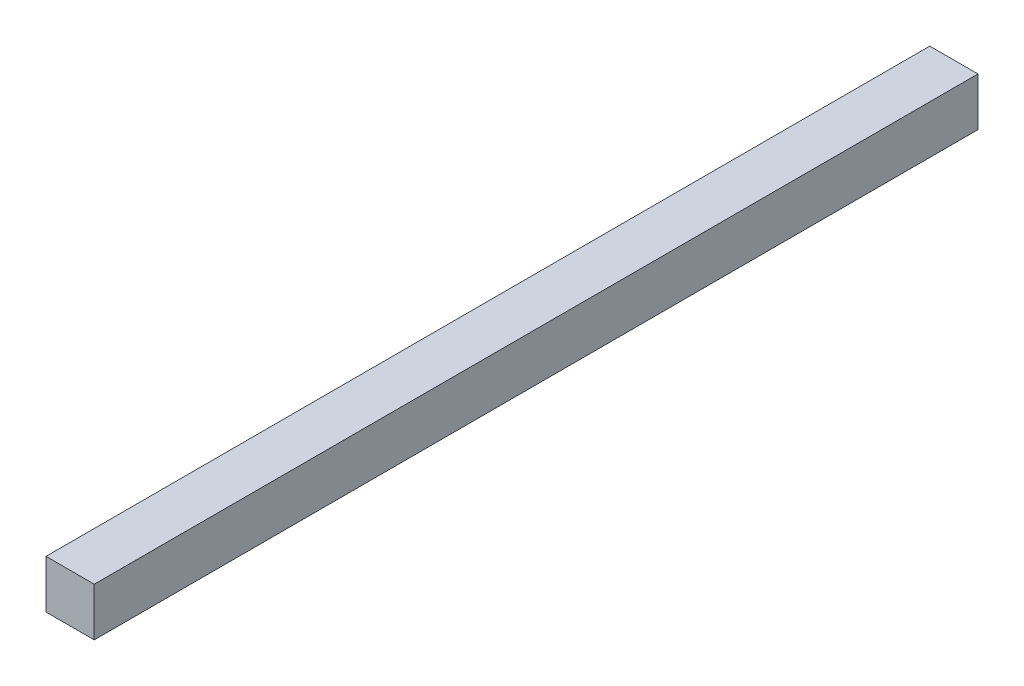
ISO-10303-21;
HEADER;
FILE_DESCRIPTION(('STEP AP214'),'2;1');
FILE_NAME('part.step','',(''),(''),'','','');
FILE_SCHEMA(('AUTOMOTIVE_DESIGN { 1 0 10303 214 1 1 1 1 }'));
ENDSEC;
DATA;
#1=APPLICATION_CONTEXT('core data for automotive mechanical design processes');
#2=APPLICATION_PROTOCOL_DEFINITION('international standard','automotive_design',2000,#1);
#3=PRODUCT_CONTEXT('',#1,'mechanical');
#4=PRODUCT('Part','Part','',(#3));
#5=PRODUCT_RELATED_PRODUCT_CATEGORY('part','',(#4));
#6=PRODUCT_DEFINITION_FORMATION('','',#4);
#7=PRODUCT_DEFINITION_CONTEXT('part definition',#1,'design');
#8=PRODUCT_DEFINITION('design','',#6,#7);
#9=PRODUCT_DEFINITION_SHAPE('','',#8);
#10=(LENGTH_UNIT() NAMED_UNIT(*) SI_UNIT(.MILLI.,.METRE.));
#11=(NAMED_UNIT(*) PLANE_ANGLE_UNIT() SI_UNIT($,.RADIAN.));
#12=(NAMED_UNIT(*) SI_UNIT($,.STERADIAN.) SOLID_ANGLE_UNIT());
#13=UNCERTAINTY_MEASURE_WITH_UNIT(LENGTH_MEASURE(1.E-05),#10,'distance_accuracy_value','');
#14=(GEOMETRIC_REPRESENTATION_CONTEXT(3) GLOBAL_UNCERTAINTY_ASSIGNED_CONTEXT((#13)) GLOBAL_UNIT_ASSIGNED_CONTEXT((#10,
#11,#12)) REPRESENTATION_CONTEXT('',''));
#15=CARTESIAN_POINT('',(0.,0.,0.));
#16=DIRECTION('',(0.,0.,1.));
#17=DIRECTION('',(1.,0.,0.));
#18=AXIS2_PLACEMENT_3D('',#15,#16,#17);
#19=CARTESIAN_POINT('',(-6.35,-6.35,116.35));
#20=DIRECTION('',(1.,0.,0.));
#21=DIRECTION('',(0.,0.,-1.));
#22=AXIS2_PLACEMENT_3D('',#19,#20,#21);
#23=PLANE('',#22);
#24=DIRECTION('',(0.,-1.,0.));
#25=VECTOR('',#24,1.);
#26=CARTESIAN_POINT('',(-6.35,-6.35,-116.35));
#27=LINE('',#26,#25);
#28=CARTESIAN_POINT('',(-6.35,6.35,-116.35));
#29=VERTEX_POINT('',#28);
#30=CARTESIAN_POINT('',(-6.35,-6.35,-116.35));
#31=VERTEX_POINT('',#30);
#32=EDGE_CURVE('E96',#29,#31,#27,.T.);
#33=ORIENTED_EDGE('',*,*,#32,.T.);
#34=DIRECTION('',(0.,0.,-1.));
#35=VECTOR('',#34,1.);
#36=CARTESIAN_POINT('',(-6.35,-6.35,116.35));
#37=LINE('',#36,#35);
#38=CARTESIAN_POINT('',(-6.35,-6.35,116.35));
#39=VERTEX_POINT('',#38);
#40=EDGE_CURVE('E11',#39,#31,#37,.T.);
#41=ORIENTED_EDGE('',*,*,#40,.F.);
#42=DIRECTION('',(0.,-1.,0.));
#43=VECTOR('',#42,1.);
#44=CARTESIAN_POINT('',(-6.35,-6.35,116.35));
#45=LINE('',#44,#43);
#46=CARTESIAN_POINT('',(-6.35,6.35,116.35));
#47=VERTEX_POINT('',#46);
#48=EDGE_CURVE('E84',#47,#39,#45,.T.);
#49=ORIENTED_EDGE('',*,*,#48,.F.);
#50=DIRECTION('',(0.,0.,-1.));
#51=VECTOR('',#50,1.);
#52=CARTESIAN_POINT('',(-6.35,6.35,116.35));
#53=LINE('',#52,#51);
#54=EDGE_CURVE('E92',#47,#29,#53,.T.);
#55=ORIENTED_EDGE('',*,*,#54,.T.);
#56=EDGE_LOOP('',(#33,#41,#49,#55));
#57=FACE_BOUND('',#56,.T.);
#58=ADVANCED_FACE('F33',(#57),#23,.F.);
#59=CARTESIAN_POINT('',(6.35,-6.35,116.35));
#60=DIRECTION('',(0.,1.,0.));
#61=DIRECTION('',(-1.,0.,0.));
#62=AXIS2_PLACEMENT_3D('',#59,#60,#61);
#63=PLANE('',#62);
#64=DIRECTION('',(1.,0.,0.));
#65=VECTOR('',#64,1.);
#66=CARTESIAN_POINT('',(6.35,-6.35,-116.35));
#67=LINE('',#66,#65);
#68=CARTESIAN_POINT('',(6.35,-6.35,-116.35));
#69=VERTEX_POINT('',#68);
#70=EDGE_CURVE('E88',#31,#69,#67,.T.);
#71=ORIENTED_EDGE('',*,*,#70,.T.);
#72=DIRECTION('',(0.,0.,-1.));
#73=VECTOR('',#72,1.);
#74=CARTESIAN_POINT('',(6.35,-6.35,116.35));
#75=LINE('',#74,#73);
#76=CARTESIAN_POINT('',(6.35,-6.35,116.35));
#77=VERTEX_POINT('',#76);
#78=EDGE_CURVE('E41',#77,#69,#75,.T.);
#79=ORIENTED_EDGE('',*,*,#78,.F.);
#80=DIRECTION('',(1.,0.,0.));
#81=VECTOR('',#80,1.);
#82=CARTESIAN_POINT('',(6.35,-6.35,116.35));
#83=LINE('',#82,#81);
#84=EDGE_CURVE('E79',#39,#77,#83,.T.);
#85=ORIENTED_EDGE('',*,*,#84,.F.);
#86=ORIENTED_EDGE('',*,*,#40,.T.);
#87=EDGE_LOOP('',(#71,#79,#85,#86));
#88=FACE_BOUND('',#87,.T.);
#89=ADVANCED_FACE('F87',(#88),#63,.F.);
#90=CARTESIAN_POINT('',(6.35,-6.35,116.35));
#91=DIRECTION('',(-1.,0.,0.));
#92=DIRECTION('',(0.,0.,1.));
#93=AXIS2_PLACEMENT_3D('',#90,#91,#92);
#94=PLANE('',#93);
#95=DIRECTION('',(0.,1.,0.));
#96=VECTOR('',#95,1.);
#97=CARTESIAN_POINT('',(6.35,-6.35,-116.35));
#98=LINE('',#97,#96);
#99=CARTESIAN_POINT('',(6.35,6.35,-116.35));
#100=VERTEX_POINT('',#99);
#101=EDGE_CURVE('E66',#69,#100,#98,.T.);
#102=ORIENTED_EDGE('',*,*,#101,.T.);
#103=DIRECTION('',(0.,0.,-1.));
#104=VECTOR('',#103,1.);
#105=CARTESIAN_POINT('',(6.35,6.35,116.35));
#106=LINE('',#105,#104);
#107=CARTESIAN_POINT('',(6.35,6.35,116.35));
#108=VERTEX_POINT('',#107);
#109=EDGE_CURVE('E89',#108,#100,#106,.T.);
#110=ORIENTED_EDGE('',*,*,#109,.F.);
#111=DIRECTION('',(0.,1.,0.));
#112=VECTOR('',#111,1.);
#113=CARTESIAN_POINT('',(6.35,-6.35,116.35));
#114=LINE('',#113,#112);
#115=EDGE_CURVE('E82',#77,#108,#114,.T.);
#116=ORIENTED_EDGE('',*,*,#115,.F.);
#117=ORIENTED_EDGE('',*,*,#78,.T.);
#118=EDGE_LOOP('',(#102,#110,#116,#117));
#119=FACE_BOUND('',#118,.T.);
#120=ADVANCED_FACE('F90',(#119),#94,.F.);
#121=CARTESIAN_POINT('',(6.35,6.35,116.35));
#122=DIRECTION('',(0.,-1.,0.));
#123=DIRECTION('',(1.,0.,0.));
#124=AXIS2_PLACEMENT_3D('',#121,#122,#123);
#125=PLANE('',#124);
#126=DIRECTION('',(-1.,0.,0.));
#127=VECTOR('',#126,1.);
#128=CARTESIAN_POINT('',(6.35,6.35,-116.35));
#129=LINE('',#128,#127);
#130=EDGE_CURVE('E72',#100,#29,#129,.T.);
#131=ORIENTED_EDGE('',*,*,#130,.T.);
#132=ORIENTED_EDGE('',*,*,#54,.F.);
#133=DIRECTION('',(-1.,0.,0.));
#134=VECTOR('',#133,1.);
#135=CARTESIAN_POINT('',(6.35,6.35,116.35));
#136=LINE('',#135,#134);
#137=EDGE_CURVE('E49',#108,#47,#136,.T.);
#138=ORIENTED_EDGE('',*,*,#137,.F.);
#139=ORIENTED_EDGE('',*,*,#109,.T.);
#140=EDGE_LOOP('',(#131,#132,#138,#139));
#141=FACE_BOUND('',#140,.T.);
#142=ADVANCED_FACE('F103',(#141),#125,.F.);
#143=CARTESIAN_POINT('',(0.,0.,116.35));
#144=DIRECTION('',(0.,0.,1.));
#145=DIRECTION('',(1.,0.,0.));
#146=AXIS2_PLACEMENT_3D('',#143,#144,#145);
#147=PLANE('',#146);
#148=ORIENTED_EDGE('',*,*,#48,.T.);
#149=ORIENTED_EDGE('',*,*,#84,.T.);
#150=ORIENTED_EDGE('',*,*,#115,.T.);
#151=ORIENTED_EDGE('',*,*,#137,.T.);
#152=EDGE_LOOP('',(#148,#149,#150,#151));
#153=FACE_BOUND('',#152,.T.);
#154=ADVANCED_FACE('F80',(#153),#147,.T.);
#155=CARTESIAN_POINT('',(0.,0.,-116.35));
#156=DIRECTION('',(0.,0.,1.));
#157=DIRECTION('',(1.,0.,0.));
#158=AXIS2_PLACEMENT_3D('',#155,#156,#157);
#159=PLANE('',#158);
#160=ORIENTED_EDGE('',*,*,#32,.F.);
#161=ORIENTED_EDGE('',*,*,#130,.F.);
#162=ORIENTED_EDGE('',*,*,#101,.F.);
#163=ORIENTED_EDGE('',*,*,#70,.F.);
#164=EDGE_LOOP('',(#160,#161,#162,#163));
#165=FACE_BOUND('',#164,.T.);
#166=ADVANCED_FACE('F106',(#165),#159,.F.);
#167=CLOSED_SHELL('',(#58,#89,#120,#142,#154,#166));
#168=MANIFOLD_SOLID_BREP('B2',#167);
#169=ADVANCED_BREP_SHAPE_REPRESENTATION('',(#18,#168),#14);
#170=SHAPE_DEFINITION_REPRESENTATION(#9,#169);
ENDSEC;
END-ISO-10303-21;
